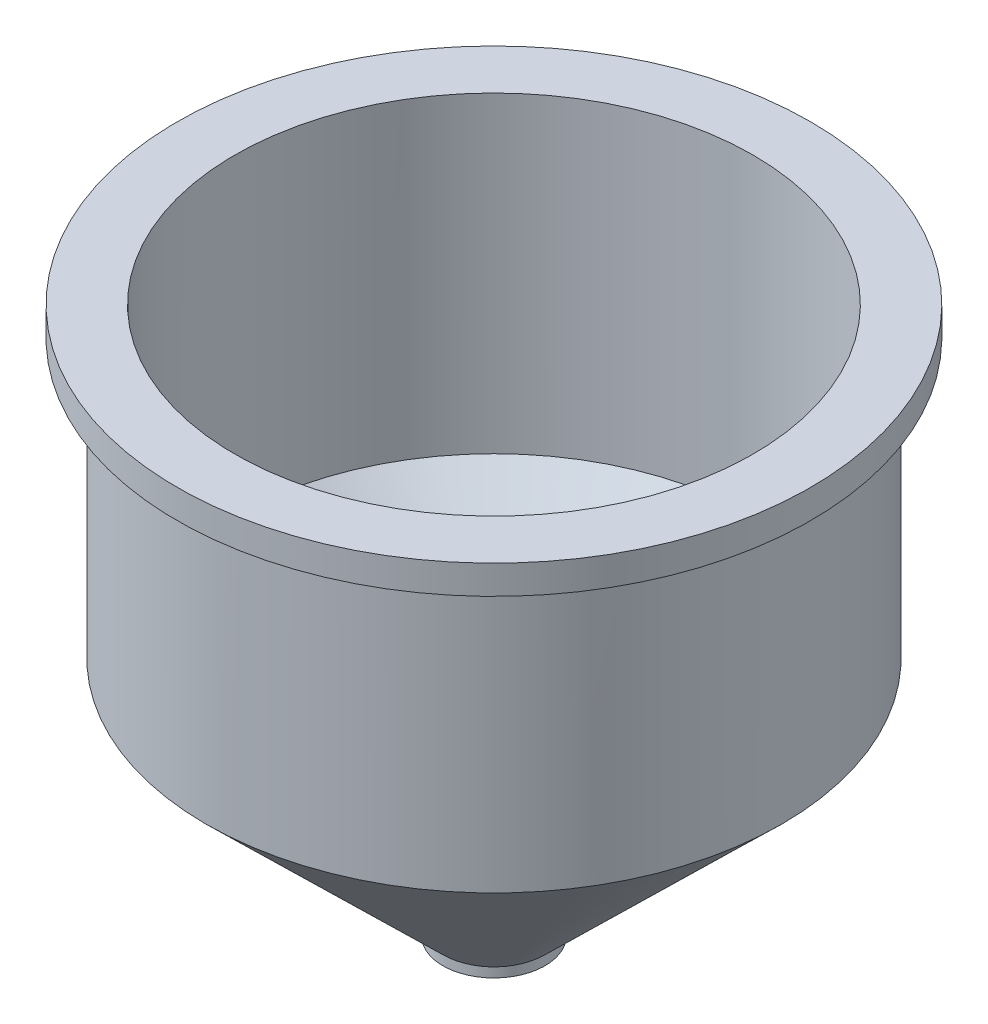
ISO-10303-21;
HEADER;
FILE_DESCRIPTION(('STEP AP214'),'2;1');
FILE_NAME('part.step','',(''),(''),'','','');
FILE_SCHEMA(('AUTOMOTIVE_DESIGN { 1 0 10303 214 1 1 1 1 }'));
ENDSEC;
DATA;
#1=APPLICATION_CONTEXT('core data for automotive mechanical design processes');
#2=APPLICATION_PROTOCOL_DEFINITION('international standard','automotive_design',2000,#1);
#3=PRODUCT_CONTEXT('',#1,'mechanical');
#4=PRODUCT('Part','Part','',(#3));
#5=PRODUCT_RELATED_PRODUCT_CATEGORY('part','',(#4));
#6=PRODUCT_DEFINITION_FORMATION('','',#4);
#7=PRODUCT_DEFINITION_CONTEXT('part definition',#1,'design');
#8=PRODUCT_DEFINITION('design','',#6,#7);
#9=PRODUCT_DEFINITION_SHAPE('','',#8);
#10=(LENGTH_UNIT() NAMED_UNIT(*) SI_UNIT(.MILLI.,.METRE.));
#11=(NAMED_UNIT(*) PLANE_ANGLE_UNIT() SI_UNIT($,.RADIAN.));
#12=(NAMED_UNIT(*) SI_UNIT($,.STERADIAN.) SOLID_ANGLE_UNIT());
#13=UNCERTAINTY_MEASURE_WITH_UNIT(LENGTH_MEASURE(1.E-05),#10,'distance_accuracy_value','');
#14=(GEOMETRIC_REPRESENTATION_CONTEXT(3) GLOBAL_UNCERTAINTY_ASSIGNED_CONTEXT((#13)) GLOBAL_UNIT_ASSIGNED_CONTEXT((#10,
#11,#12)) REPRESENTATION_CONTEXT('',''));
#15=CARTESIAN_POINT('',(0.,0.,0.));
#16=DIRECTION('',(0.,0.,1.));
#17=DIRECTION('',(1.,0.,0.));
#18=AXIS2_PLACEMENT_3D('',#15,#16,#17);
#19=CARTESIAN_POINT('',(0.,-57.,0.));
#20=DIRECTION('',(0.,-1.,0.));
#21=DIRECTION('',(0.,0.,-1.));
#22=AXIS2_PLACEMENT_3D('',#19,#20,#21);
#23=PLANE('',#22);
#24=CARTESIAN_POINT('',(0.,-57.,0.));
#25=DIRECTION('',(0.,-1.,0.));
#26=DIRECTION('',(0.,0.,-1.));
#27=AXIS2_PLACEMENT_3D('',#24,#25,#26);
#28=CIRCLE('',#27,5.32910618128339);
#29=CARTESIAN_POINT('',(0.,-57.,-5.32910618128339));
#30=VERTEX_POINT('',#29);
#31=EDGE_CURVE('E10',#30,#30,#28,.T.);
#32=ORIENTED_EDGE('',*,*,#31,.T.);
#33=EDGE_LOOP('',(#32));
#34=FACE_BOUND('',#33,.T.);
#35=ADVANCED_FACE('F37',(#34),#23,.T.);
#36=CARTESIAN_POINT('',(0.,-69.9733976855224,0.));
#37=DIRECTION('',(0.,-1.,0.));
#38=DIRECTION('',(0.,0.,-1.));
#39=AXIS2_PLACEMENT_3D('',#36,#37,#38);
#40=CYLINDRICAL_SURFACE('',#39,5.32910618128339);
#41=CARTESIAN_POINT('',(0.,-56.,0.));
#42=DIRECTION('',(0.,-1.,0.));
#43=DIRECTION('',(0.,0.,-1.));
#44=AXIS2_PLACEMENT_3D('',#41,#42,#43);
#45=CIRCLE('',#44,5.32910618128339);
#46=CARTESIAN_POINT('',(0.,-56.,5.32910618128339));
#47=VERTEX_POINT('',#46);
#48=EDGE_CURVE('E43',#47,#47,#45,.T.);
#49=ORIENTED_EDGE('',*,*,#48,.T.);
#50=EDGE_LOOP('',(#49));
#51=FACE_BOUND('',#50,.T.);
#52=ORIENTED_EDGE('',*,*,#31,.F.);
#53=EDGE_LOOP('',(#52));
#54=FACE_BOUND('',#53,.T.);
#55=ADVANCED_FACE('F90',(#51,#54),#40,.T.);
#56=CARTESIAN_POINT('',(0.,-56.,0.));
#57=DIRECTION('',(0.,1.,0.));
#58=DIRECTION('',(0.,0.,1.));
#59=AXIS2_PLACEMENT_3D('',#56,#57,#58);
#60=CONICAL_SURFACE('',#59,5.32910618128339,0.796801689975533);
#61=CARTESIAN_POINT('',(0.,-31.8854563305147,0.));
#62=DIRECTION('',(0.,-1.,0.));
#63=DIRECTION('',(0.,0.,-1.));
#64=AXIS2_PLACEMENT_3D('',#61,#62,#63);
#65=CIRCLE('',#64,30.);
#66=CARTESIAN_POINT('',(0.,-31.8854563305147,30.));
#67=VERTEX_POINT('',#66);
#68=EDGE_CURVE('E47',#67,#67,#65,.T.);
#69=CARTESIAN_POINT('',(0.,-31.8854563305147,30.));
#70=CARTESIAN_POINT('',(0.,-32.1366494937385,29.7430115227217));
#71=CARTESIAN_POINT('',(0.,-32.3878426569623,29.4860230454434));
#72=CARTESIAN_POINT('',(0.,-32.8902289834099,28.9720460908868));
#73=CARTESIAN_POINT('',(0.,-33.1414221466337,28.7150576136085));
#74=CARTESIAN_POINT('',(0.,-33.6438084730814,28.2010806590519));
#75=CARTESIAN_POINT('',(0.,-33.8950016363052,27.9440921817736));
#76=CARTESIAN_POINT('',(0.,-34.3973879627528,27.430115227217));
#77=CARTESIAN_POINT('',(0.,-34.6485811259766,27.1731267499387));
#78=CARTESIAN_POINT('',(0.,-35.1509674524242,26.6591497953821));
#79=CARTESIAN_POINT('',(0.,-35.402160615648,26.4021613181038));
#80=CARTESIAN_POINT('',(0.,-35.9045469420956,25.8881843635472));
#81=CARTESIAN_POINT('',(0.,-36.1557401053194,25.6311958862689));
#82=CARTESIAN_POINT('',(0.,-36.658126431767,25.1172189317124));
#83=CARTESIAN_POINT('',(0.,-36.9093195949908,24.8602304544341));
#84=CARTESIAN_POINT('',(0.,-37.4117059214384,24.3462534998775));
#85=CARTESIAN_POINT('',(0.,-37.6628990846622,24.0892650225992));
#86=CARTESIAN_POINT('',(0.,-38.1652854111098,23.5752880680426));
#87=CARTESIAN_POINT('',(0.,-38.4164785743336,23.3182995907643));
#88=CARTESIAN_POINT('',(0.,-38.9188649007813,22.8043226362077));
#89=CARTESIAN_POINT('',(0.,-39.1700580640051,22.5473341589294));
#90=CARTESIAN_POINT('',(0.,-39.6724443904527,22.0333572043728));
#91=CARTESIAN_POINT('',(0.,-39.9236375536765,21.7763687270945));
#92=CARTESIAN_POINT('',(0.,-40.4260238801241,21.2623917725379));
#93=CARTESIAN_POINT('',(0.,-40.6772170433479,21.0054032952596));
#94=CARTESIAN_POINT('',(0.,-41.1796033697955,20.491426340703));
#95=CARTESIAN_POINT('',(0.,-41.4307965330193,20.2344378634247));
#96=CARTESIAN_POINT('',(0.,-41.9331828594669,19.7204609088681));
#97=CARTESIAN_POINT('',(0.,-42.1843760226907,19.4634724315898));
#98=CARTESIAN_POINT('',(0.,-42.6867623491383,18.9494954770332));
#99=CARTESIAN_POINT('',(0.,-42.9379555123621,18.6925069997549));
#100=CARTESIAN_POINT('',(0.,-43.4403418388098,18.1785300451983));
#101=CARTESIAN_POINT('',(0.,-43.6915350020336,17.92154156792));
#102=CARTESIAN_POINT('',(0.,-44.1939213284812,17.4075646133634));
#103=CARTESIAN_POINT('',(0.,-44.445114491705,17.1505761360851));
#104=CARTESIAN_POINT('',(0.,-44.9475008181526,16.6365991815285));
#105=CARTESIAN_POINT('',(0.,-45.1986939813764,16.3796107042502));
#106=CARTESIAN_POINT('',(0.,-45.701080307824,15.8656337496936));
#107=CARTESIAN_POINT('',(0.,-45.9522734710478,15.6086452724153));
#108=CARTESIAN_POINT('',(0.,-46.4546597974954,15.0946683178587));
#109=CARTESIAN_POINT('',(0.,-46.7058529607192,14.8376798405804));
#110=CARTESIAN_POINT('',(0.,-47.2082392871668,14.3237028860238));
#111=CARTESIAN_POINT('',(0.,-47.4594324503906,14.0667144087455));
#112=CARTESIAN_POINT('',(0.,-47.9618187768382,13.5527374541889));
#113=CARTESIAN_POINT('',(0.,-48.213011940062,13.2957489769106));
#114=CARTESIAN_POINT('',(0.,-48.7153982665097,12.781772022354));
#115=CARTESIAN_POINT('',(0.,-48.9665914297335,12.5247835450757));
#116=CARTESIAN_POINT('',(0.,-49.4689777561811,12.0108065905191));
#117=CARTESIAN_POINT('',(0.,-49.7201709194049,11.7538181132408));
#118=CARTESIAN_POINT('',(0.,-50.2225572458525,11.2398411586843));
#119=CARTESIAN_POINT('',(0.,-50.4737504090763,10.982852681406));
#120=CARTESIAN_POINT('',(0.,-50.9761367355239,10.4688757268494));
#121=CARTESIAN_POINT('',(0.,-51.2273298987477,10.2118872495711));
#122=CARTESIAN_POINT('',(0.,-51.7297162251953,9.69791029501446));
#123=CARTESIAN_POINT('',(0.,-51.9809093884191,9.44092181773616));
#124=CARTESIAN_POINT('',(0.,-52.4832957148667,8.92694486317957));
#125=CARTESIAN_POINT('',(0.,-52.7344888780905,8.66995638590127));
#126=CARTESIAN_POINT('',(0.,-53.2368752045382,8.15597943134467));
#127=CARTESIAN_POINT('',(0.,-53.488068367762,7.89899095406638));
#128=CARTESIAN_POINT('',(0.,-53.9904546942096,7.38501399950978));
#129=CARTESIAN_POINT('',(0.,-54.2416478574334,7.12802552223148));
#130=CARTESIAN_POINT('',(0.,-54.744034183881,6.61404856767488));
#131=CARTESIAN_POINT('',(0.,-54.9952273471048,6.35706009039659));
#132=CARTESIAN_POINT('',(0.,-55.4976136735524,5.84308313583999));
#133=CARTESIAN_POINT('',(0.,-55.7488068367762,5.58609465856169));
#134=CARTESIAN_POINT('',(0.,-56.,5.32910618128339));
#135=B_SPLINE_CURVE_WITH_KNOTS('',3,(#69,#70,#71,#72,#73,#74,#75,#76,#77,#78,#79,#80,#81,#82,
#83,#84,#85,#86,#87,#88,#89,#90,#91,#92,#93,#94,#95,#96,#97,#98,#99,#100,#101,#102,#103,#104,
#105,#106,#107,#108,#109,#110,#111,#112,#113,#114,#115,#116,#117,#118,#119,#120,#121,#122,#123,
#124,#125,#126,#127,#128,#129,#130,#131,#132,#133,#134),.UNSPECIFIED.,.F.,.F.,(4,2,2,2,2,2,2,2,
2,2,2,2,2,2,2,2,2,2,2,2,2,2,2,2,2,2,2,2,2,2,2,2,4),(0.,1.07808614884794,2.15617229769589,
3.23425844654384,4.31234459539178,5.39043074423973,6.46851689308768,7.54660304193562,
8.62468919078357,9.70277533963151,10.7808614884795,11.8589476373274,12.9370337861754,
14.0151199350233,15.0932060838713,16.1712922327192,17.2493783815671,18.3274645304151,
19.405550679263,20.483636828111,21.5617229769589,22.6398091258069,23.7178952746548,
24.7959814235028,25.8740675723507,26.9521537211987,28.0302398700466,29.1083260188946,
30.1864121677425,31.2644983165905,32.3425844654384,33.4206706142863,34.4987567631343),.UNSPECIFIED.);
#136=EDGE_CURVE('BSEAM94',#67,#47,#135,.T.);
#137=ORIENTED_EDGE('',*,*,#68,.T.);
#138=ORIENTED_EDGE('',*,*,#48,.F.);
#139=ORIENTED_EDGE('',*,*,#136,.T.);
#140=ORIENTED_EDGE('',*,*,#136,.F.);
#141=EDGE_LOOP('',(#137,#139,#138,#140));
#142=FACE_BOUND('',#141,.T.);
#143=ADVANCED_FACE('F94',(#142),#60,.T.);
#144=CARTESIAN_POINT('',(0.,-69.9733976855224,0.));
#145=DIRECTION('',(0.,-1.,0.));
#146=DIRECTION('',(0.,0.,-1.));
#147=AXIS2_PLACEMENT_3D('',#144,#145,#146);
#148=CYLINDRICAL_SURFACE('',#147,30.);
#149=CARTESIAN_POINT('',(0.,-3.,0.));
#150=DIRECTION('',(0.,-1.,0.));
#151=DIRECTION('',(0.,0.,-1.));
#152=AXIS2_PLACEMENT_3D('',#149,#150,#151);
#153=CIRCLE('',#152,30.);
#154=CARTESIAN_POINT('',(0.,-3.,-30.));
#155=VERTEX_POINT('',#154);
#156=EDGE_CURVE('E51',#155,#155,#153,.T.);
#157=ORIENTED_EDGE('',*,*,#156,.T.);
#158=EDGE_LOOP('',(#157));
#159=FACE_BOUND('',#158,.T.);
#160=ORIENTED_EDGE('',*,*,#68,.F.);
#161=EDGE_LOOP('',(#160));
#162=FACE_BOUND('',#161,.T.);
#163=ADVANCED_FACE('F98',(#159,#162),#148,.T.);
#164=CARTESIAN_POINT('',(30.,-3.,0.));
#165=DIRECTION('',(0.,-1.,0.));
#166=DIRECTION('',(0.,0.,-1.));
#167=AXIS2_PLACEMENT_3D('',#164,#165,#166);
#168=PLANE('',#167);
#169=CARTESIAN_POINT('',(0.,-3.,0.));
#170=DIRECTION('',(0.,-1.,0.));
#171=DIRECTION('',(0.,0.,-1.));
#172=AXIS2_PLACEMENT_3D('',#169,#170,#171);
#173=CIRCLE('',#172,33.);
#174=CARTESIAN_POINT('',(0.,-3.,-33.));
#175=VERTEX_POINT('',#174);
#176=EDGE_CURVE('E56',#175,#175,#173,.T.);
#177=ORIENTED_EDGE('',*,*,#176,.T.);
#178=EDGE_LOOP('',(#177));
#179=FACE_BOUND('',#178,.T.);
#180=ORIENTED_EDGE('',*,*,#156,.F.);
#181=EDGE_LOOP('',(#180));
#182=FACE_BOUND('',#181,.T.);
#183=ADVANCED_FACE('F105',(#179,#182),#168,.T.);
#184=CARTESIAN_POINT('',(0.,-69.9733976855224,0.));
#185=DIRECTION('',(0.,-1.,0.));
#186=DIRECTION('',(0.,0.,-1.));
#187=AXIS2_PLACEMENT_3D('',#184,#185,#186);
#188=CYLINDRICAL_SURFACE('',#187,33.);
#189=CARTESIAN_POINT('',(0.,0.,0.));
#190=DIRECTION('',(0.,-1.,0.));
#191=DIRECTION('',(0.,0.,-1.));
#192=AXIS2_PLACEMENT_3D('',#189,#190,#191);
#193=CIRCLE('',#192,33.);
#194=CARTESIAN_POINT('',(0.,0.,-33.));
#195=VERTEX_POINT('',#194);
#196=EDGE_CURVE('E59',#195,#195,#193,.T.);
#197=ORIENTED_EDGE('',*,*,#196,.T.);
#198=EDGE_LOOP('',(#197));
#199=FACE_BOUND('',#198,.T.);
#200=ORIENTED_EDGE('',*,*,#176,.F.);
#201=EDGE_LOOP('',(#200));
#202=FACE_BOUND('',#201,.T.);
#203=ADVANCED_FACE('F109',(#199,#202),#188,.T.);
#204=CARTESIAN_POINT('',(33.,0.,0.));
#205=DIRECTION('',(0.,1.,0.));
#206=DIRECTION('',(0.,0.,1.));
#207=AXIS2_PLACEMENT_3D('',#204,#205,#206);
#208=PLANE('',#207);
#209=CARTESIAN_POINT('',(0.,0.,0.));
#210=DIRECTION('',(0.,-1.,0.));
#211=DIRECTION('',(0.,0.,-1.));
#212=AXIS2_PLACEMENT_3D('',#209,#210,#211);
#213=CIRCLE('',#212,27.);
#214=CARTESIAN_POINT('',(0.,0.,-27.));
#215=VERTEX_POINT('',#214);
#216=EDGE_CURVE('E62',#215,#215,#213,.T.);
#217=ORIENTED_EDGE('',*,*,#216,.T.);
#218=EDGE_LOOP('',(#217));
#219=FACE_BOUND('',#218,.T.);
#220=ORIENTED_EDGE('',*,*,#196,.F.);
#221=EDGE_LOOP('',(#220));
#222=FACE_BOUND('',#221,.T.);
#223=ADVANCED_FACE('F113',(#219,#222),#208,.T.);
#224=CARTESIAN_POINT('',(0.,-69.9733976855224,0.));
#225=DIRECTION('',(0.,-1.,0.));
#226=DIRECTION('',(0.,0.,-1.));
#227=AXIS2_PLACEMENT_3D('',#224,#225,#226);
#228=CYLINDRICAL_SURFACE('',#227,27.);
#229=CARTESIAN_POINT('',(0.,-32.547808544572,0.));
#230=DIRECTION('',(0.,-1.,0.));
#231=DIRECTION('',(0.,0.,-1.));
#232=AXIS2_PLACEMENT_3D('',#229,#230,#231);
#233=CIRCLE('',#232,27.);
#234=CARTESIAN_POINT('',(0.,-32.547808544572,27.));
#235=VERTEX_POINT('',#234);
#236=EDGE_CURVE('E65',#235,#235,#233,.T.);
#237=ORIENTED_EDGE('',*,*,#236,.T.);
#238=EDGE_LOOP('',(#237));
#239=FACE_BOUND('',#238,.T.);
#240=ORIENTED_EDGE('',*,*,#216,.F.);
#241=EDGE_LOOP('',(#240));
#242=FACE_BOUND('',#241,.T.);
#243=ADVANCED_FACE('F117',(#239,#242),#228,.F.);
#244=CARTESIAN_POINT('',(0.,-32.547808544572,0.));
#245=DIRECTION('',(0.,1.,0.));
#246=DIRECTION('',(0.,0.,1.));
#247=AXIS2_PLACEMENT_3D('',#244,#245,#246);
#248=CONICAL_SURFACE('',#247,27.,0.805256509291258);
#249=CARTESIAN_POINT('',(0.,-51.,0.));
#250=DIRECTION('',(0.,-1.,0.));
#251=DIRECTION('',(0.,0.,-1.));
#252=AXIS2_PLACEMENT_3D('',#249,#250,#251);
#253=CIRCLE('',#252,7.8);
#254=CARTESIAN_POINT('',(0.,-51.,7.8));
#255=VERTEX_POINT('',#254);
#256=EDGE_CURVE('E68',#255,#255,#253,.T.);
#257=CARTESIAN_POINT('',(0.,-51.,7.8));
#258=CARTESIAN_POINT('',(0.,-50.8077896723393,8.));
#259=CARTESIAN_POINT('',(0.,-50.6155793446786,8.2));
#260=CARTESIAN_POINT('',(0.,-50.2311586893572,8.6));
#261=CARTESIAN_POINT('',(0.,-50.0389483616965,8.8));
#262=CARTESIAN_POINT('',(0.,-49.6545277063751,9.19999999999999));
#263=CARTESIAN_POINT('',(0.,-49.4623173787143,9.4));
#264=CARTESIAN_POINT('',(0.,-49.0778967233929,9.8));
#265=CARTESIAN_POINT('',(0.,-48.8856863957322,10.));
#266=CARTESIAN_POINT('',(0.,-48.5012657404108,10.4));
#267=CARTESIAN_POINT('',(0.,-48.3090554127501,10.6));
#268=CARTESIAN_POINT('',(0.,-47.9246347574287,11.));
#269=CARTESIAN_POINT('',(0.,-47.732424429768,11.2));
#270=CARTESIAN_POINT('',(0.,-47.3480037744466,11.6));
#271=CARTESIAN_POINT('',(0.,-47.1557934467858,11.8));
#272=CARTESIAN_POINT('',(0.,-46.7713727914644,12.2));
#273=CARTESIAN_POINT('',(0.,-46.5791624638037,12.4));
#274=CARTESIAN_POINT('',(0.,-46.1947418084823,12.8));
#275=CARTESIAN_POINT('',(0.,-46.0025314808216,13.));
#276=CARTESIAN_POINT('',(0.,-45.6181108255002,13.4));
#277=CARTESIAN_POINT('',(0.,-45.4259004978395,13.6));
#278=CARTESIAN_POINT('',(0.,-45.0414798425181,14.));
#279=CARTESIAN_POINT('',(0.,-44.8492695148573,14.2));
#280=CARTESIAN_POINT('',(0.,-44.4648488595359,14.6));
#281=CARTESIAN_POINT('',(0.,-44.2726385318752,14.8));
#282=CARTESIAN_POINT('',(0.,-43.8882178765538,15.2));
#283=CARTESIAN_POINT('',(0.,-43.6960075488931,15.4));
#284=CARTESIAN_POINT('',(0.,-43.3115868935717,15.8));
#285=CARTESIAN_POINT('',(0.,-43.119376565911,16.));
#286=CARTESIAN_POINT('',(0.,-42.7349559105895,16.4));
#287=CARTESIAN_POINT('',(0.,-42.5427455829288,16.6));
#288=CARTESIAN_POINT('',(0.,-42.1583249276074,17.));
#289=CARTESIAN_POINT('',(0.,-41.9661145999467,17.2));
#290=CARTESIAN_POINT('',(0.,-41.5816939446253,17.6));
#291=CARTESIAN_POINT('',(0.,-41.3894836169646,17.8));
#292=CARTESIAN_POINT('',(0.,-41.0050629616432,18.2));
#293=CARTESIAN_POINT('',(0.,-40.8128526339825,18.4));
#294=CARTESIAN_POINT('',(0.,-40.428431978661,18.8));
#295=CARTESIAN_POINT('',(0.,-40.2362216510003,19.));
#296=CARTESIAN_POINT('',(0.,-39.8518009956789,19.4));
#297=CARTESIAN_POINT('',(0.,-39.6595906680182,19.6));
#298=CARTESIAN_POINT('',(0.,-39.2751700126968,20.));
#299=CARTESIAN_POINT('',(0.,-39.0829596850361,20.2));
#300=CARTESIAN_POINT('',(0.,-38.6985390297147,20.6));
#301=CARTESIAN_POINT('',(0.,-38.506328702054,20.8));
#302=CARTESIAN_POINT('',(0.,-38.1219080467325,21.2));
#303=CARTESIAN_POINT('',(0.,-37.9296977190718,21.4));
#304=CARTESIAN_POINT('',(0.,-37.5452770637504,21.8));
#305=CARTESIAN_POINT('',(0.,-37.3530667360897,22.));
#306=CARTESIAN_POINT('',(0.,-36.9686460807683,22.4));
#307=CARTESIAN_POINT('',(0.,-36.7764357531076,22.6));
#308=CARTESIAN_POINT('',(0.,-36.3920150977862,23.));
#309=CARTESIAN_POINT('',(0.,-36.1998047701255,23.2));
#310=CARTESIAN_POINT('',(0.,-35.815384114804,23.6));
#311=CARTESIAN_POINT('',(0.,-35.6231737871433,23.8));
#312=CARTESIAN_POINT('',(0.,-35.2387531318219,24.2));
#313=CARTESIAN_POINT('',(0.,-35.0465428041612,24.4));
#314=CARTESIAN_POINT('',(0.,-34.6621221488398,24.8));
#315=CARTESIAN_POINT('',(0.,-34.4699118211791,25.));
#316=CARTESIAN_POINT('',(0.,-34.0854911658577,25.4));
#317=CARTESIAN_POINT('',(0.,-33.893280838197,25.6));
#318=CARTESIAN_POINT('',(0.,-33.5088601828755,26.));
#319=CARTESIAN_POINT('',(0.,-33.3166498552148,26.2));
#320=CARTESIAN_POINT('',(0.,-32.9322291998934,26.6));
#321=CARTESIAN_POINT('',(0.,-32.7400188722327,26.8));
#322=CARTESIAN_POINT('',(0.,-32.547808544572,27.));
#323=B_SPLINE_CURVE_WITH_KNOTS('',3,(#257,#258,#259,#260,#261,#262,#263,#264,#265,#266,#267,
#268,#269,#270,#271,#272,#273,#274,#275,#276,#277,#278,#279,#280,#281,#282,#283,#284,#285,#286,
#287,#288,#289,#290,#291,#292,#293,#294,#295,#296,#297,#298,#299,#300,#301,#302,#303,#304,#305,
#306,#307,#308,#309,#310,#311,#312,#313,#314,#315,#316,#317,#318,#319,#320,#321,#322),
.UNSPECIFIED.,.F.,.F.,(4,2,2,2,2,2,2,2,2,2,2,2,2,2,2,2,2,2,2,2,2,2,2,2,2,2,2,2,2,2,2,2,4),(0.,
0.832167825943142,1.66433565188628,2.49650347782942,3.32867130377256,4.1608391297157,
4.99300695565883,5.82517478160198,6.65734260754512,7.48951043348826,8.3216782594314,
9.15384608537454,9.98601391131768,10.8181817372608,11.650349563204,12.4825173891471,
13.3146852150902,14.1468530410334,14.9790208669765,15.8111886929197,16.6433565188628,
17.4755243448059,18.3076921707491,19.1398599966922,19.9720278226354,20.8041956485785,
21.6363634745216,22.4685313004648,23.3006991264079,24.1328669523511,24.9650347782942,
25.7972026042373,26.6293704301805),.UNSPECIFIED.);
#324=EDGE_CURVE('BSEAM121',#255,#235,#323,.T.);
#325=ORIENTED_EDGE('',*,*,#256,.T.);
#326=ORIENTED_EDGE('',*,*,#236,.F.);
#327=ORIENTED_EDGE('',*,*,#324,.T.);
#328=ORIENTED_EDGE('',*,*,#324,.F.);
#329=EDGE_LOOP('',(#325,#327,#326,#328));
#330=FACE_BOUND('',#329,.T.);
#331=ADVANCED_FACE('F121',(#330),#248,.F.);
#332=CARTESIAN_POINT('',(3.8,-51.,0.));
#333=DIRECTION('',(0.,1.,0.));
#334=DIRECTION('',(0.,0.,1.));
#335=AXIS2_PLACEMENT_3D('',#332,#333,#334);
#336=PLANE('',#335);
#337=CARTESIAN_POINT('',(0.,-51.,0.));
#338=DIRECTION('',(0.,-1.,0.));
#339=DIRECTION('',(0.,0.,-1.));
#340=AXIS2_PLACEMENT_3D('',#337,#338,#339);
#341=CIRCLE('',#340,3.8);
#342=CARTESIAN_POINT('',(0.,-51.,-3.8));
#343=VERTEX_POINT('',#342);
#344=EDGE_CURVE('E71',#343,#343,#341,.T.);
#345=ORIENTED_EDGE('',*,*,#344,.T.);
#346=EDGE_LOOP('',(#345));
#347=FACE_BOUND('',#346,.T.);
#348=ORIENTED_EDGE('',*,*,#256,.F.);
#349=EDGE_LOOP('',(#348));
#350=FACE_BOUND('',#349,.T.);
#351=ADVANCED_FACE('F87',(#347,#350),#336,.T.);
#352=CARTESIAN_POINT('',(0.,-69.9733976855224,0.));
#353=DIRECTION('',(0.,-1.,0.));
#354=DIRECTION('',(0.,0.,-1.));
#355=AXIS2_PLACEMENT_3D('',#352,#353,#354);
#356=CYLINDRICAL_SURFACE('',#355,3.8);
#357=CARTESIAN_POINT('',(0.,-56.,0.));
#358=DIRECTION('',(0.,-1.,0.));
#359=DIRECTION('',(0.,0.,-1.));
#360=AXIS2_PLACEMENT_3D('',#357,#358,#359);
#361=CIRCLE('',#360,3.8);
#362=CARTESIAN_POINT('',(0.,-56.,-3.8));
#363=VERTEX_POINT('',#362);
#364=EDGE_CURVE('E74',#363,#363,#361,.T.);
#365=ORIENTED_EDGE('',*,*,#364,.T.);
#366=EDGE_LOOP('',(#365));
#367=FACE_BOUND('',#366,.T.);
#368=ORIENTED_EDGE('',*,*,#344,.F.);
#369=EDGE_LOOP('',(#368));
#370=FACE_BOUND('',#369,.T.);
#371=ADVANCED_FACE('F78',(#367,#370),#356,.F.);
#372=CARTESIAN_POINT('',(0.,-56.,0.));
#373=DIRECTION('',(0.,1.,0.));
#374=DIRECTION('',(0.,0.,1.));
#375=AXIS2_PLACEMENT_3D('',#372,#373,#374);
#376=PLANE('',#375);
#377=ORIENTED_EDGE('',*,*,#364,.F.);
#378=EDGE_LOOP('',(#377));
#379=FACE_BOUND('',#378,.T.);
#380=ADVANCED_FACE('F81',(#379),#376,.T.);
#381=CLOSED_SHELL('',(#35,#55,#143,#163,#183,#203,#223,#243,#331,#351,#371,#380));
#382=MANIFOLD_SOLID_BREP('B2',#381);
#383=ADVANCED_BREP_SHAPE_REPRESENTATION('',(#18,#382),#14);
#384=SHAPE_DEFINITION_REPRESENTATION(#9,#383);
ENDSEC;
END-ISO-10303-21;
